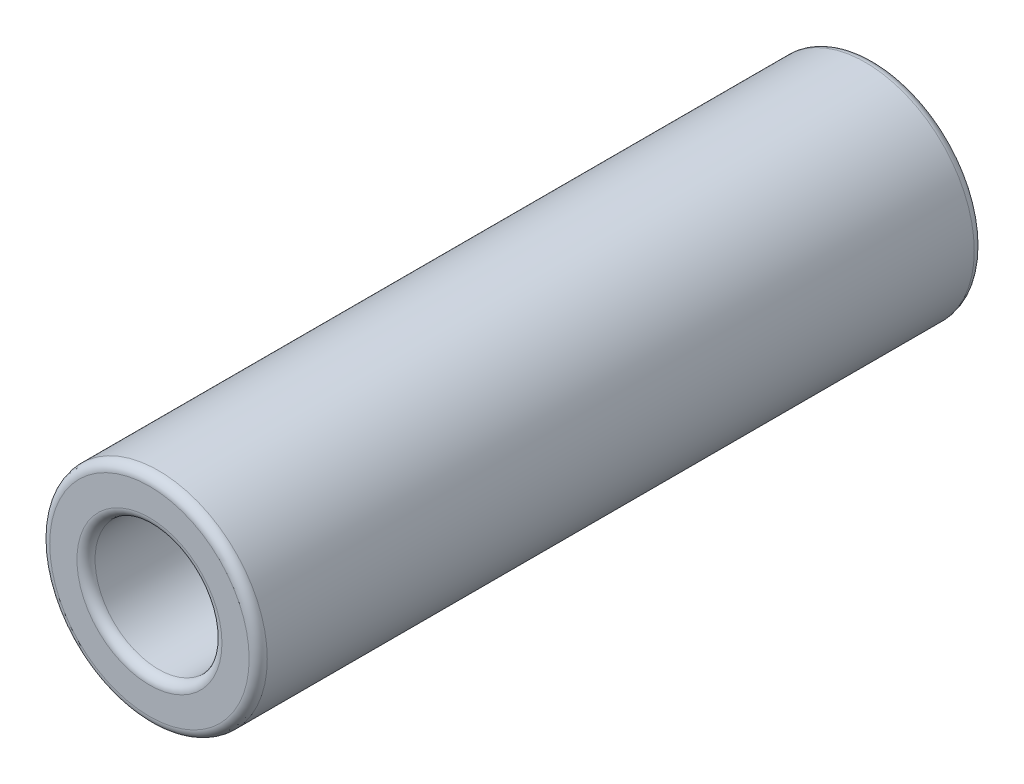
ISO-10303-21;
HEADER;
FILE_DESCRIPTION(('STEP AP214'),'2;1');
FILE_NAME('part.step','',(''),(''),'','','');
FILE_SCHEMA(('AUTOMOTIVE_DESIGN { 1 0 10303 214 1 1 1 1 }'));
ENDSEC;
DATA;
#1=APPLICATION_CONTEXT('core data for automotive mechanical design processes');
#2=APPLICATION_PROTOCOL_DEFINITION('international standard','automotive_design',2000,#1);
#3=PRODUCT_CONTEXT('',#1,'mechanical');
#4=PRODUCT('Part','Part','',(#3));
#5=PRODUCT_RELATED_PRODUCT_CATEGORY('part','',(#4));
#6=PRODUCT_DEFINITION_FORMATION('','',#4);
#7=PRODUCT_DEFINITION_CONTEXT('part definition',#1,'design');
#8=PRODUCT_DEFINITION('design','',#6,#7);
#9=PRODUCT_DEFINITION_SHAPE('','',#8);
#10=(LENGTH_UNIT() NAMED_UNIT(*) SI_UNIT(.MILLI.,.METRE.));
#11=(NAMED_UNIT(*) PLANE_ANGLE_UNIT() SI_UNIT($,.RADIAN.));
#12=(NAMED_UNIT(*) SI_UNIT($,.STERADIAN.) SOLID_ANGLE_UNIT());
#13=UNCERTAINTY_MEASURE_WITH_UNIT(LENGTH_MEASURE(1.E-05),#10,'distance_accuracy_value','');
#14=(GEOMETRIC_REPRESENTATION_CONTEXT(3) GLOBAL_UNCERTAINTY_ASSIGNED_CONTEXT((#13)) GLOBAL_UNIT_ASSIGNED_CONTEXT((#10,
#11,#12)) REPRESENTATION_CONTEXT('',''));
#15=CARTESIAN_POINT('',(0.,0.,0.));
#16=DIRECTION('',(0.,0.,1.));
#17=DIRECTION('',(1.,0.,0.));
#18=AXIS2_PLACEMENT_3D('',#15,#16,#17);
#19=CARTESIAN_POINT('',(0.,0.,40.));
#20=DIRECTION('',(0.,0.,1.));
#21=DIRECTION('',(1.,0.,0.));
#22=AXIS2_PLACEMENT_3D('',#19,#20,#21);
#23=PLANE('',#22);
#24=CARTESIAN_POINT('',(0.,0.,40.));
#25=DIRECTION('',(0.,0.,1.));
#26=DIRECTION('',(1.,0.,0.));
#27=AXIS2_PLACEMENT_3D('',#24,#25,#26);
#28=CIRCLE('',#27,4.);
#29=CARTESIAN_POINT('',(4.,0.,40.));
#30=VERTEX_POINT('',#29);
#31=EDGE_CURVE('E51',#30,#30,#28,.F.);
#32=ORIENTED_EDGE('',*,*,#31,.T.);
#33=EDGE_LOOP('',(#32));
#34=FACE_BOUND('',#33,.T.);
#35=CARTESIAN_POINT('',(0.,0.,40.));
#36=DIRECTION('',(0.,0.,1.));
#37=DIRECTION('',(1.,0.,0.));
#38=AXIS2_PLACEMENT_3D('',#35,#36,#37);
#39=CIRCLE('',#38,5.5);
#40=CARTESIAN_POINT('',(5.5,0.,40.));
#41=VERTEX_POINT('',#40);
#42=EDGE_CURVE('E56',#41,#41,#39,.T.);
#43=ORIENTED_EDGE('',*,*,#42,.T.);
#44=EDGE_LOOP('',(#43));
#45=FACE_BOUND('',#44,.T.);
#46=ADVANCED_FACE('F43',(#34,#45),#23,.T.);
#47=CARTESIAN_POINT('',(0.,0.,0.));
#48=DIRECTION('',(0.,0.,1.));
#49=DIRECTION('',(1.,0.,0.));
#50=AXIS2_PLACEMENT_3D('',#47,#48,#49);
#51=PLANE('',#50);
#52=CARTESIAN_POINT('',(0.,0.,0.));
#53=DIRECTION('',(0.,0.,1.));
#54=DIRECTION('',(1.,0.,0.));
#55=AXIS2_PLACEMENT_3D('',#52,#53,#54);
#56=CIRCLE('',#55,4.);
#57=CARTESIAN_POINT('',(4.,0.,0.));
#58=VERTEX_POINT('',#57);
#59=EDGE_CURVE('E75',#58,#58,#56,.T.);
#60=ORIENTED_EDGE('',*,*,#59,.T.);
#61=EDGE_LOOP('',(#60));
#62=FACE_BOUND('',#61,.T.);
#63=CARTESIAN_POINT('',(0.,0.,0.));
#64=DIRECTION('',(0.,0.,1.));
#65=DIRECTION('',(1.,0.,0.));
#66=AXIS2_PLACEMENT_3D('',#63,#64,#65);
#67=CIRCLE('',#66,5.5);
#68=CARTESIAN_POINT('',(5.5,0.,0.));
#69=VERTEX_POINT('',#68);
#70=EDGE_CURVE('E79',#69,#69,#67,.F.);
#71=ORIENTED_EDGE('',*,*,#70,.T.);
#72=EDGE_LOOP('',(#71));
#73=FACE_BOUND('',#72,.T.);
#74=ADVANCED_FACE('F84',(#62,#73),#51,.F.);
#75=CARTESIAN_POINT('',(0.,0.,40.));
#76=DIRECTION('',(0.,0.,-1.));
#77=DIRECTION('',(-1.,0.,0.));
#78=AXIS2_PLACEMENT_3D('',#75,#76,#77);
#79=CYLINDRICAL_SURFACE('',#78,6.);
#80=CARTESIAN_POINT('',(0.,0.,39.5));
#81=DIRECTION('',(0.,0.,1.));
#82=DIRECTION('',(1.,0.,0.));
#83=AXIS2_PLACEMENT_3D('',#80,#81,#82);
#84=CIRCLE('',#83,6.);
#85=CARTESIAN_POINT('',(6.,0.,39.5));
#86=VERTEX_POINT('',#85);
#87=EDGE_CURVE('E11',#86,#86,#84,.F.);
#88=ORIENTED_EDGE('',*,*,#87,.T.);
#89=EDGE_LOOP('',(#88));
#90=FACE_BOUND('',#89,.T.);
#91=CARTESIAN_POINT('',(0.,0.,0.5));
#92=DIRECTION('',(0.,0.,1.));
#93=DIRECTION('',(1.,0.,0.));
#94=AXIS2_PLACEMENT_3D('',#91,#92,#93);
#95=CIRCLE('',#94,6.);
#96=CARTESIAN_POINT('',(6.,0.,0.5));
#97=VERTEX_POINT('',#96);
#98=EDGE_CURVE('E67',#97,#97,#95,.T.);
#99=ORIENTED_EDGE('',*,*,#98,.T.);
#100=EDGE_LOOP('',(#99));
#101=FACE_BOUND('',#100,.T.);
#102=ADVANCED_FACE('F94',(#90,#101),#79,.T.);
#103=CARTESIAN_POINT('',(0.,0.,40.));
#104=DIRECTION('',(0.,0.,-1.));
#105=DIRECTION('',(-1.,0.,0.));
#106=AXIS2_PLACEMENT_3D('',#103,#104,#105);
#107=CYLINDRICAL_SURFACE('',#106,3.5);
#108=CARTESIAN_POINT('',(0.,0.,39.5));
#109=DIRECTION('',(0.,0.,1.));
#110=DIRECTION('',(1.,0.,0.));
#111=AXIS2_PLACEMENT_3D('',#108,#109,#110);
#112=CIRCLE('',#111,3.5);
#113=CARTESIAN_POINT('',(3.5,0.,39.5));
#114=VERTEX_POINT('',#113);
#115=EDGE_CURVE('E61',#114,#114,#112,.T.);
#116=ORIENTED_EDGE('',*,*,#115,.T.);
#117=EDGE_LOOP('',(#116));
#118=FACE_BOUND('',#117,.T.);
#119=CARTESIAN_POINT('',(0.,0.,0.5));
#120=DIRECTION('',(0.,0.,1.));
#121=DIRECTION('',(1.,0.,0.));
#122=AXIS2_PLACEMENT_3D('',#119,#120,#121);
#123=CIRCLE('',#122,3.5);
#124=CARTESIAN_POINT('',(3.5,0.,0.5));
#125=VERTEX_POINT('',#124);
#126=EDGE_CURVE('E71',#125,#125,#123,.F.);
#127=ORIENTED_EDGE('',*,*,#126,.T.);
#128=EDGE_LOOP('',(#127));
#129=FACE_BOUND('',#128,.T.);
#130=ADVANCED_FACE('F96',(#118,#129),#107,.F.);
#131=CARTESIAN_POINT('',(0.,0.,0.5));
#132=DIRECTION('',(0.,0.,1.));
#133=DIRECTION('',(1.,0.,0.));
#134=AXIS2_PLACEMENT_3D('',#131,#132,#133);
#135=TOROIDAL_SURFACE('',#134,4.,0.5);
#136=ORIENTED_EDGE('',*,*,#126,.F.);
#137=EDGE_LOOP('',(#136));
#138=FACE_BOUND('',#137,.T.);
#139=ORIENTED_EDGE('',*,*,#59,.F.);
#140=EDGE_LOOP('',(#139));
#141=FACE_BOUND('',#140,.T.);
#142=ADVANCED_FACE('F90',(#138,#141),#135,.T.);
#143=CARTESIAN_POINT('',(0.,0.,0.5));
#144=DIRECTION('',(0.,0.,1.));
#145=DIRECTION('',(1.,0.,0.));
#146=AXIS2_PLACEMENT_3D('',#143,#144,#145);
#147=TOROIDAL_SURFACE('',#146,5.5,0.5);
#148=ORIENTED_EDGE('',*,*,#70,.F.);
#149=EDGE_LOOP('',(#148));
#150=FACE_BOUND('',#149,.T.);
#151=ORIENTED_EDGE('',*,*,#98,.F.);
#152=EDGE_LOOP('',(#151));
#153=FACE_BOUND('',#152,.T.);
#154=ADVANCED_FACE('F86',(#150,#153),#147,.T.);
#155=CARTESIAN_POINT('',(0.,0.,39.5));
#156=DIRECTION('',(0.,0.,1.));
#157=DIRECTION('',(1.,0.,0.));
#158=AXIS2_PLACEMENT_3D('',#155,#156,#157);
#159=TOROIDAL_SURFACE('',#158,4.,0.5);
#160=ORIENTED_EDGE('',*,*,#31,.F.);
#161=EDGE_LOOP('',(#160));
#162=FACE_BOUND('',#161,.T.);
#163=ORIENTED_EDGE('',*,*,#115,.F.);
#164=EDGE_LOOP('',(#163));
#165=FACE_BOUND('',#164,.T.);
#166=ADVANCED_FACE('F89',(#162,#165),#159,.T.);
#167=CARTESIAN_POINT('',(0.,0.,39.5));
#168=DIRECTION('',(0.,0.,1.));
#169=DIRECTION('',(1.,0.,0.));
#170=AXIS2_PLACEMENT_3D('',#167,#168,#169);
#171=TOROIDAL_SURFACE('',#170,5.5,0.5);
#172=ORIENTED_EDGE('',*,*,#87,.F.);
#173=EDGE_LOOP('',(#172));
#174=FACE_BOUND('',#173,.T.);
#175=ORIENTED_EDGE('',*,*,#42,.F.);
#176=EDGE_LOOP('',(#175));
#177=FACE_BOUND('',#176,.T.);
#178=ADVANCED_FACE('F45',(#174,#177),#171,.T.);
#179=CLOSED_SHELL('',(#46,#74,#102,#130,#142,#154,#166,#178));
#180=MANIFOLD_SOLID_BREP('B2',#179);
#181=ADVANCED_BREP_SHAPE_REPRESENTATION('',(#18,#180),#14);
#182=SHAPE_DEFINITION_REPRESENTATION(#9,#181);
ENDSEC;
END-ISO-10303-21;
